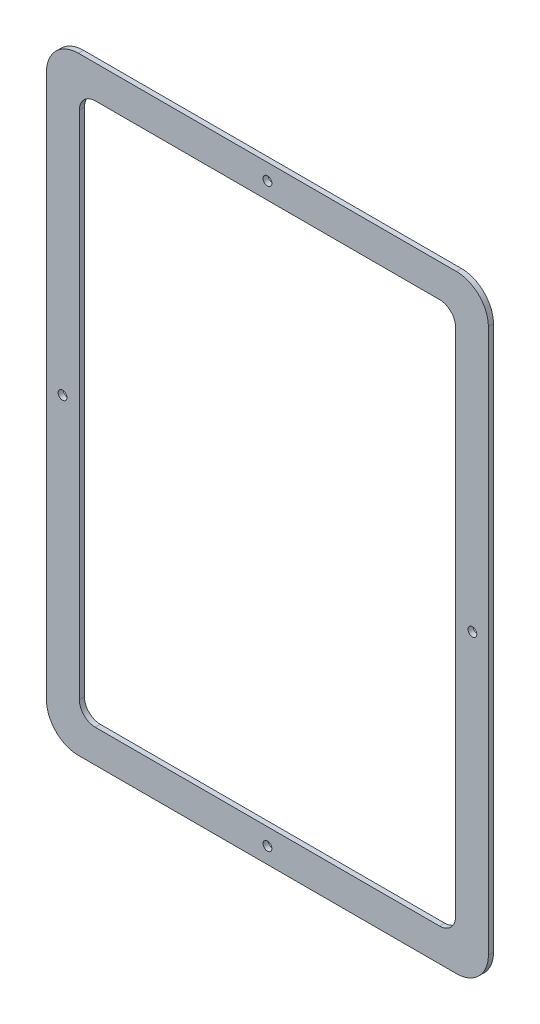
ISO-10303-21;
HEADER;
FILE_DESCRIPTION(('STEP AP214'),'2;1');
FILE_NAME('part.step','',(''),(''),'','','');
FILE_SCHEMA(('AUTOMOTIVE_DESIGN { 1 0 10303 214 1 1 1 1 }'));
ENDSEC;
DATA;
#1=APPLICATION_CONTEXT('core data for automotive mechanical design processes');
#2=APPLICATION_PROTOCOL_DEFINITION('international standard','automotive_design',2000,#1);
#3=PRODUCT_CONTEXT('',#1,'mechanical');
#4=PRODUCT('Part','Part','',(#3));
#5=PRODUCT_RELATED_PRODUCT_CATEGORY('part','',(#4));
#6=PRODUCT_DEFINITION_FORMATION('','',#4);
#7=PRODUCT_DEFINITION_CONTEXT('part definition',#1,'design');
#8=PRODUCT_DEFINITION('design','',#6,#7);
#9=PRODUCT_DEFINITION_SHAPE('','',#8);
#10=(LENGTH_UNIT() NAMED_UNIT(*) SI_UNIT(.MILLI.,.METRE.));
#11=(NAMED_UNIT(*) PLANE_ANGLE_UNIT() SI_UNIT($,.RADIAN.));
#12=(NAMED_UNIT(*) SI_UNIT($,.STERADIAN.) SOLID_ANGLE_UNIT());
#13=UNCERTAINTY_MEASURE_WITH_UNIT(LENGTH_MEASURE(1.E-05),#10,'distance_accuracy_value','');
#14=(GEOMETRIC_REPRESENTATION_CONTEXT(3) GLOBAL_UNCERTAINTY_ASSIGNED_CONTEXT((#13)) GLOBAL_UNIT_ASSIGNED_CONTEXT((#10,
#11,#12)) REPRESENTATION_CONTEXT('',''));
#15=CARTESIAN_POINT('',(0.,0.,0.));
#16=DIRECTION('',(0.,0.,1.));
#17=DIRECTION('',(1.,0.,0.));
#18=AXIS2_PLACEMENT_3D('',#15,#16,#17);
#19=CARTESIAN_POINT('',(-544.089347611488,-12.4195033639551,-257.580431195113));
#20=DIRECTION('',(0.,0.,1.));
#21=DIRECTION('',(1.,0.,0.));
#22=AXIS2_PLACEMENT_3D('',#19,#20,#21);
#23=PLANE('',#22);
#24=DIRECTION('',(0.,1.,0.));
#25=VECTOR('',#24,1.);
#26=CARTESIAN_POINT('',(-490.489347611488,-587.399903363955,-257.580431195113));
#27=LINE('',#26,#25);
#28=CARTESIAN_POINT('',(-490.489347611488,-567.399903363955,-257.580431195113));
#29=VERTEX_POINT('',#28);
#30=CARTESIAN_POINT('',(-490.489347611488,-227.543903363955,-257.580431195113));
#31=VERTEX_POINT('',#30);
#32=EDGE_CURVE('E246',#29,#31,#27,.T.);
#33=ORIENTED_EDGE('',*,*,#32,.F.);
#34=CARTESIAN_POINT('',(-470.489347611488,-567.399903363955,-257.580431195113));
#35=DIRECTION('',(0.,0.,-1.));
#36=DIRECTION('',(-1.,0.,0.));
#37=AXIS2_PLACEMENT_3D('',#34,#35,#36);
#38=CIRCLE('',#37,20.);
#39=CARTESIAN_POINT('',(-470.489347611488,-587.399903363955,-257.580431195113));
#40=VERTEX_POINT('',#39);
#41=EDGE_CURVE('E224',#40,#29,#38,.T.);
#42=ORIENTED_EDGE('',*,*,#41,.F.);
#43=DIRECTION('',(1.,0.,0.));
#44=VECTOR('',#43,1.);
#45=CARTESIAN_POINT('',(-214.489347611488,-587.399903363955,-257.580431195113));
#46=LINE('',#45,#44);
#47=CARTESIAN_POINT('',(-234.489347611488,-587.399903363955,-257.580431195113));
#48=VERTEX_POINT('',#47);
#49=EDGE_CURVE('E154',#48,#40,#46,.F.);
#50=ORIENTED_EDGE('',*,*,#49,.F.);
#51=CARTESIAN_POINT('',(-234.489347611488,-567.399903363955,-257.580431195113));
#52=DIRECTION('',(0.,0.,1.));
#53=DIRECTION('',(1.,0.,0.));
#54=AXIS2_PLACEMENT_3D('',#51,#52,#53);
#55=CIRCLE('',#54,20.);
#56=CARTESIAN_POINT('',(-214.489347611488,-567.399903363955,-257.580431195113));
#57=VERTEX_POINT('',#56);
#58=EDGE_CURVE('E219',#57,#48,#55,.F.);
#59=ORIENTED_EDGE('',*,*,#58,.F.);
#60=DIRECTION('',(0.,1.,0.));
#61=VECTOR('',#60,1.);
#62=CARTESIAN_POINT('',(-214.489347611488,-207.543903363955,-257.580431195113));
#63=LINE('',#62,#61);
#64=CARTESIAN_POINT('',(-214.489347611488,-227.543903363955,-257.580431195113));
#65=VERTEX_POINT('',#64);
#66=EDGE_CURVE('E222',#65,#57,#63,.F.);
#67=ORIENTED_EDGE('',*,*,#66,.F.);
#68=CARTESIAN_POINT('',(-234.489347611488,-227.543903363955,-257.580431195113));
#69=DIRECTION('',(0.,0.,1.));
#70=DIRECTION('',(1.,0.,0.));
#71=AXIS2_PLACEMENT_3D('',#68,#69,#70);
#72=CIRCLE('',#71,20.);
#73=CARTESIAN_POINT('',(-234.489347611488,-207.543903363955,-257.580431195113));
#74=VERTEX_POINT('',#73);
#75=EDGE_CURVE('E214',#74,#65,#72,.F.);
#76=ORIENTED_EDGE('',*,*,#75,.F.);
#77=DIRECTION('',(1.,0.,0.));
#78=VECTOR('',#77,1.);
#79=CARTESIAN_POINT('',(-490.489347611488,-207.543903363955,-257.580431195113));
#80=LINE('',#79,#78);
#81=CARTESIAN_POINT('',(-470.489347611488,-207.543903363955,-257.580431195113));
#82=VERTEX_POINT('',#81);
#83=EDGE_CURVE('E217',#82,#74,#80,.T.);
#84=ORIENTED_EDGE('',*,*,#83,.F.);
#85=CARTESIAN_POINT('',(-470.489347611488,-227.543903363955,-257.580431195113));
#86=DIRECTION('',(0.,0.,1.));
#87=DIRECTION('',(1.,0.,0.));
#88=AXIS2_PLACEMENT_3D('',#85,#86,#87);
#89=CIRCLE('',#88,20.);
#90=EDGE_CURVE('E209',#31,#82,#89,.F.);
#91=ORIENTED_EDGE('',*,*,#90,.F.);
#92=EDGE_LOOP('',(#33,#42,#50,#59,#67,#76,#84,#91));
#93=FACE_BOUND('',#92,.T.);
#94=CARTESIAN_POINT('',(-480.489347611488,-397.471903363955,-257.580431195113));
#95=DIRECTION('',(0.,0.,1.));
#96=DIRECTION('',(1.,0.,0.));
#97=AXIS2_PLACEMENT_3D('',#94,#95,#96);
#98=CIRCLE('',#97,2.75);
#99=CARTESIAN_POINT('',(-477.739347611488,-397.471903363955,-257.580431195113));
#100=VERTEX_POINT('',#99);
#101=EDGE_CURVE('E229',#100,#100,#98,.F.);
#102=ORIENTED_EDGE('',*,*,#101,.T.);
#103=EDGE_LOOP('',(#102));
#104=FACE_BOUND('',#103,.T.);
#105=CARTESIAN_POINT('',(-352.489347611488,-217.543903363955,-257.580431195113));
#106=DIRECTION('',(0.,0.,1.));
#107=DIRECTION('',(1.,0.,0.));
#108=AXIS2_PLACEMENT_3D('',#105,#106,#107);
#109=CIRCLE('',#108,2.75);
#110=CARTESIAN_POINT('',(-349.739347611488,-217.543903363955,-257.580431195113));
#111=VERTEX_POINT('',#110);
#112=EDGE_CURVE('E147',#111,#111,#109,.F.);
#113=ORIENTED_EDGE('',*,*,#112,.T.);
#114=EDGE_LOOP('',(#113));
#115=FACE_BOUND('',#114,.T.);
#116=CARTESIAN_POINT('',(-352.489347611488,-577.399903363955,-257.580431195113));
#117=DIRECTION('',(0.,0.,1.));
#118=DIRECTION('',(1.,0.,0.));
#119=AXIS2_PLACEMENT_3D('',#116,#117,#118);
#120=CIRCLE('',#119,2.75);
#121=CARTESIAN_POINT('',(-349.739347611488,-577.399903363955,-257.580431195113));
#122=VERTEX_POINT('',#121);
#123=EDGE_CURVE('E150',#122,#122,#120,.F.);
#124=ORIENTED_EDGE('',*,*,#123,.T.);
#125=EDGE_LOOP('',(#124));
#126=FACE_BOUND('',#125,.T.);
#127=CARTESIAN_POINT('',(-224.489347611488,-397.471903363955,-257.580431195113));
#128=DIRECTION('',(0.,0.,1.));
#129=DIRECTION('',(1.,0.,0.));
#130=AXIS2_PLACEMENT_3D('',#127,#128,#129);
#131=CIRCLE('',#130,2.75);
#132=CARTESIAN_POINT('',(-221.739347611488,-397.471903363955,-257.580431195113));
#133=VERTEX_POINT('',#132);
#134=EDGE_CURVE('E226',#133,#133,#131,.F.);
#135=ORIENTED_EDGE('',*,*,#134,.T.);
#136=EDGE_LOOP('',(#135));
#137=FACE_BOUND('',#136,.T.);
#138=DIRECTION('',(0.,1.,0.));
#139=VECTOR('',#138,1.);
#140=CARTESIAN_POINT('',(-234.989347611488,-547.399903363955,-257.580431195113));
#141=LINE('',#140,#139);
#142=CARTESIAN_POINT('',(-234.989347611488,-556.899903363955,-257.580431195113));
#143=VERTEX_POINT('',#142);
#144=CARTESIAN_POINT('',(-234.989347611488,-238.043903363955,-257.580431195113));
#145=VERTEX_POINT('',#144);
#146=EDGE_CURVE('E156',#143,#145,#141,.T.);
#147=ORIENTED_EDGE('',*,*,#146,.F.);
#148=CARTESIAN_POINT('',(-244.989347611488,-556.899903363955,-257.580431195113));
#149=DIRECTION('',(0.,0.,1.));
#150=DIRECTION('',(1.,0.,0.));
#151=AXIS2_PLACEMENT_3D('',#148,#149,#150);
#152=CIRCLE('',#151,10.);
#153=CARTESIAN_POINT('',(-244.989347611488,-566.899903363955,-257.580431195113));
#154=VERTEX_POINT('',#153);
#155=EDGE_CURVE('E146',#143,#154,#152,.F.);
#156=ORIENTED_EDGE('',*,*,#155,.T.);
#157=DIRECTION('',(1.,0.,0.));
#158=VECTOR('',#157,1.);
#159=CARTESIAN_POINT('',(-450.489347611488,-566.899903363955,-257.580431195113));
#160=LINE('',#159,#158);
#161=CARTESIAN_POINT('',(-459.989347611488,-566.899903363955,-257.580431195113));
#162=VERTEX_POINT('',#161);
#163=EDGE_CURVE('E139',#162,#154,#160,.T.);
#164=ORIENTED_EDGE('',*,*,#163,.F.);
#165=CARTESIAN_POINT('',(-459.989347611488,-556.899903363955,-257.580431195113));
#166=DIRECTION('',(0.,0.,1.));
#167=DIRECTION('',(1.,0.,0.));
#168=AXIS2_PLACEMENT_3D('',#165,#166,#167);
#169=CIRCLE('',#168,10.);
#170=CARTESIAN_POINT('',(-469.989347611488,-556.899903363955,-257.580431195113));
#171=VERTEX_POINT('',#170);
#172=EDGE_CURVE('E20',#162,#171,#169,.F.);
#173=ORIENTED_EDGE('',*,*,#172,.T.);
#174=DIRECTION('',(0.,1.,0.));
#175=VECTOR('',#174,1.);
#176=CARTESIAN_POINT('',(-469.989347611488,-247.543903363955,-257.580431195113));
#177=LINE('',#176,#175);
#178=CARTESIAN_POINT('',(-469.989347611488,-238.043903363955,-257.580431195113));
#179=VERTEX_POINT('',#178);
#180=EDGE_CURVE('E166',#179,#171,#177,.F.);
#181=ORIENTED_EDGE('',*,*,#180,.F.);
#182=CARTESIAN_POINT('',(-459.989347611488,-238.043903363955,-257.580431195113));
#183=DIRECTION('',(0.,0.,1.));
#184=DIRECTION('',(1.,0.,0.));
#185=AXIS2_PLACEMENT_3D('',#182,#183,#184);
#186=CIRCLE('',#185,10.);
#187=CARTESIAN_POINT('',(-459.989347611488,-228.043903363955,-257.580431195113));
#188=VERTEX_POINT('',#187);
#189=EDGE_CURVE('E236',#179,#188,#186,.F.);
#190=ORIENTED_EDGE('',*,*,#189,.T.);
#191=DIRECTION('',(1.,0.,0.));
#192=VECTOR('',#191,1.);
#193=CARTESIAN_POINT('',(-254.489347611488,-228.043903363955,-257.580431195113));
#194=LINE('',#193,#192);
#195=CARTESIAN_POINT('',(-244.989347611488,-228.043903363955,-257.580431195113));
#196=VERTEX_POINT('',#195);
#197=EDGE_CURVE('E161',#196,#188,#194,.F.);
#198=ORIENTED_EDGE('',*,*,#197,.F.);
#199=CARTESIAN_POINT('',(-244.989347611488,-238.043903363955,-257.580431195113));
#200=DIRECTION('',(0.,0.,1.));
#201=DIRECTION('',(1.,0.,0.));
#202=AXIS2_PLACEMENT_3D('',#199,#200,#201);
#203=CIRCLE('',#202,10.);
#204=EDGE_CURVE('E235',#196,#145,#203,.F.);
#205=ORIENTED_EDGE('',*,*,#204,.T.);
#206=EDGE_LOOP('',(#147,#156,#164,#173,#181,#190,#198,#205));
#207=FACE_BOUND('',#206,.T.);
#208=ADVANCED_FACE('F17',(#93,#104,#115,#126,#137,#207),#23,.T.);
#209=CARTESIAN_POINT('',(-459.989347611488,-556.899903363955,-260.755431195113));
#210=DIRECTION('',(0.,0.,1.));
#211=DIRECTION('',(1.,0.,0.));
#212=AXIS2_PLACEMENT_3D('',#209,#210,#211);
#213=CYLINDRICAL_SURFACE('',#212,10.);
#214=ORIENTED_EDGE('',*,*,#172,.F.);
#215=DIRECTION('',(0.,0.,1.));
#216=VECTOR('',#215,1.);
#217=CARTESIAN_POINT('',(-459.989347611488,-566.899903363955,-260.755431195113));
#218=LINE('',#217,#216);
#219=CARTESIAN_POINT('',(-459.989347611488,-566.899903363955,-260.755431195113));
#220=VERTEX_POINT('',#219);
#221=EDGE_CURVE('E130',#220,#162,#218,.T.);
#222=ORIENTED_EDGE('',*,*,#221,.F.);
#223=CARTESIAN_POINT('',(-459.989347611488,-556.899903363955,-260.755431195113));
#224=DIRECTION('',(0.,0.,1.));
#225=DIRECTION('',(1.,0.,0.));
#226=AXIS2_PLACEMENT_3D('',#223,#224,#225);
#227=CIRCLE('',#226,10.);
#228=CARTESIAN_POINT('',(-469.989347611488,-556.899903363955,-260.755431195113));
#229=VERTEX_POINT('',#228);
#230=EDGE_CURVE('E207',#220,#229,#227,.F.);
#231=ORIENTED_EDGE('',*,*,#230,.T.);
#232=DIRECTION('',(0.,0.,-1.));
#233=VECTOR('',#232,1.);
#234=CARTESIAN_POINT('',(-469.989347611488,-556.899903363955,-260.755431195113));
#235=LINE('',#234,#233);
#236=EDGE_CURVE('E132',#171,#229,#235,.T.);
#237=ORIENTED_EDGE('',*,*,#236,.F.);
#238=EDGE_LOOP('',(#214,#222,#231,#237));
#239=FACE_BOUND('',#238,.T.);
#240=ADVANCED_FACE('F128',(#239),#213,.F.);
#241=CARTESIAN_POINT('',(-469.989347611488,-247.543903363955,-260.755431195113));
#242=DIRECTION('',(1.,0.,0.));
#243=DIRECTION('',(0.,0.,-1.));
#244=AXIS2_PLACEMENT_3D('',#241,#242,#243);
#245=PLANE('',#244);
#246=DIRECTION('',(0.,0.,1.));
#247=VECTOR('',#246,1.);
#248=CARTESIAN_POINT('',(-469.989347611488,-238.043903363955,-260.755431195113));
#249=LINE('',#248,#247);
#250=CARTESIAN_POINT('',(-469.989347611488,-238.043903363955,-260.755431195113));
#251=VERTEX_POINT('',#250);
#252=EDGE_CURVE('E168',#251,#179,#249,.T.);
#253=ORIENTED_EDGE('',*,*,#252,.T.);
#254=ORIENTED_EDGE('',*,*,#180,.T.);
#255=ORIENTED_EDGE('',*,*,#236,.T.);
#256=DIRECTION('',(0.,1.,0.));
#257=VECTOR('',#256,1.);
#258=CARTESIAN_POINT('',(-469.989347611488,-12.4195033639551,-260.755431195113));
#259=LINE('',#258,#257);
#260=EDGE_CURVE('E206',#229,#251,#259,.T.);
#261=ORIENTED_EDGE('',*,*,#260,.T.);
#262=EDGE_LOOP('',(#253,#254,#255,#261));
#263=FACE_BOUND('',#262,.T.);
#264=ADVANCED_FACE('F488',(#263),#245,.T.);
#265=CARTESIAN_POINT('',(-459.989347611488,-238.043903363955,-260.755431195113));
#266=DIRECTION('',(0.,0.,1.));
#267=DIRECTION('',(1.,0.,0.));
#268=AXIS2_PLACEMENT_3D('',#265,#266,#267);
#269=CYLINDRICAL_SURFACE('',#268,10.);
#270=ORIENTED_EDGE('',*,*,#189,.F.);
#271=ORIENTED_EDGE('',*,*,#252,.F.);
#272=CARTESIAN_POINT('',(-459.989347611488,-238.043903363955,-260.755431195113));
#273=DIRECTION('',(0.,0.,1.));
#274=DIRECTION('',(1.,0.,0.));
#275=AXIS2_PLACEMENT_3D('',#272,#273,#274);
#276=CIRCLE('',#275,10.);
#277=CARTESIAN_POINT('',(-459.989347611488,-228.043903363955,-260.755431195113));
#278=VERTEX_POINT('',#277);
#279=EDGE_CURVE('E203',#251,#278,#276,.F.);
#280=ORIENTED_EDGE('',*,*,#279,.T.);
#281=DIRECTION('',(0.,0.,-1.));
#282=VECTOR('',#281,1.);
#283=CARTESIAN_POINT('',(-459.989347611488,-228.043903363955,-260.755431195113));
#284=LINE('',#283,#282);
#285=EDGE_CURVE('E165',#188,#278,#284,.T.);
#286=ORIENTED_EDGE('',*,*,#285,.F.);
#287=EDGE_LOOP('',(#270,#271,#280,#286));
#288=FACE_BOUND('',#287,.T.);
#289=ADVANCED_FACE('F480',(#288),#269,.F.);
#290=CARTESIAN_POINT('',(-254.489347611488,-228.043903363955,-260.755431195113));
#291=DIRECTION('',(0.,-1.,0.));
#292=DIRECTION('',(0.,0.,-1.));
#293=AXIS2_PLACEMENT_3D('',#290,#291,#292);
#294=PLANE('',#293);
#295=DIRECTION('',(0.,0.,1.));
#296=VECTOR('',#295,1.);
#297=CARTESIAN_POINT('',(-244.989347611488,-228.043903363955,-260.755431195113));
#298=LINE('',#297,#296);
#299=CARTESIAN_POINT('',(-244.989347611488,-228.043903363955,-260.755431195113));
#300=VERTEX_POINT('',#299);
#301=EDGE_CURVE('E164',#300,#196,#298,.T.);
#302=ORIENTED_EDGE('',*,*,#301,.T.);
#303=ORIENTED_EDGE('',*,*,#197,.T.);
#304=ORIENTED_EDGE('',*,*,#285,.T.);
#305=DIRECTION('',(1.,0.,0.));
#306=VECTOR('',#305,1.);
#307=CARTESIAN_POINT('',(-544.089347611488,-228.043903363955,-260.755431195113));
#308=LINE('',#307,#306);
#309=EDGE_CURVE('E202',#278,#300,#308,.T.);
#310=ORIENTED_EDGE('',*,*,#309,.T.);
#311=EDGE_LOOP('',(#302,#303,#304,#310));
#312=FACE_BOUND('',#311,.T.);
#313=ADVANCED_FACE('F269',(#312),#294,.T.);
#314=CARTESIAN_POINT('',(-244.989347611488,-238.043903363955,-260.755431195113));
#315=DIRECTION('',(0.,0.,1.));
#316=DIRECTION('',(1.,0.,0.));
#317=AXIS2_PLACEMENT_3D('',#314,#315,#316);
#318=CYLINDRICAL_SURFACE('',#317,10.);
#319=ORIENTED_EDGE('',*,*,#204,.F.);
#320=ORIENTED_EDGE('',*,*,#301,.F.);
#321=CARTESIAN_POINT('',(-244.989347611488,-238.043903363955,-260.755431195113));
#322=DIRECTION('',(0.,0.,1.));
#323=DIRECTION('',(1.,0.,0.));
#324=AXIS2_PLACEMENT_3D('',#321,#322,#323);
#325=CIRCLE('',#324,10.);
#326=CARTESIAN_POINT('',(-234.989347611488,-238.043903363955,-260.755431195113));
#327=VERTEX_POINT('',#326);
#328=EDGE_CURVE('E199',#300,#327,#325,.F.);
#329=ORIENTED_EDGE('',*,*,#328,.T.);
#330=DIRECTION('',(0.,0.,1.));
#331=VECTOR('',#330,1.);
#332=CARTESIAN_POINT('',(-234.989347611488,-238.043903363955,-260.755431195113));
#333=LINE('',#332,#331);
#334=EDGE_CURVE('E160',#145,#327,#333,.F.);
#335=ORIENTED_EDGE('',*,*,#334,.F.);
#336=EDGE_LOOP('',(#319,#320,#329,#335));
#337=FACE_BOUND('',#336,.T.);
#338=ADVANCED_FACE('F275',(#337),#318,.F.);
#339=CARTESIAN_POINT('',(-234.989347611488,-547.399903363955,-260.755431195113));
#340=DIRECTION('',(-1.,0.,0.));
#341=DIRECTION('',(0.,0.,1.));
#342=AXIS2_PLACEMENT_3D('',#339,#340,#341);
#343=PLANE('',#342);
#344=DIRECTION('',(0.,0.,1.));
#345=VECTOR('',#344,1.);
#346=CARTESIAN_POINT('',(-234.989347611488,-556.899903363955,-260.755431195113));
#347=LINE('',#346,#345);
#348=CARTESIAN_POINT('',(-234.989347611488,-556.899903363955,-260.755431195113));
#349=VERTEX_POINT('',#348);
#350=EDGE_CURVE('E159',#349,#143,#347,.T.);
#351=ORIENTED_EDGE('',*,*,#350,.T.);
#352=ORIENTED_EDGE('',*,*,#146,.T.);
#353=ORIENTED_EDGE('',*,*,#334,.T.);
#354=DIRECTION('',(0.,1.,0.));
#355=VECTOR('',#354,1.);
#356=CARTESIAN_POINT('',(-234.989347611488,-12.4195033639551,-260.755431195113));
#357=LINE('',#356,#355);
#358=EDGE_CURVE('E198',#327,#349,#357,.F.);
#359=ORIENTED_EDGE('',*,*,#358,.T.);
#360=EDGE_LOOP('',(#351,#352,#353,#359));
#361=FACE_BOUND('',#360,.T.);
#362=ADVANCED_FACE('F457',(#361),#343,.T.);
#363=CARTESIAN_POINT('',(-244.989347611488,-556.899903363955,-260.755431195113));
#364=DIRECTION('',(0.,0.,1.));
#365=DIRECTION('',(1.,0.,0.));
#366=AXIS2_PLACEMENT_3D('',#363,#364,#365);
#367=CYLINDRICAL_SURFACE('',#366,10.);
#368=ORIENTED_EDGE('',*,*,#155,.F.);
#369=ORIENTED_EDGE('',*,*,#350,.F.);
#370=CARTESIAN_POINT('',(-244.989347611488,-556.899903363955,-260.755431195113));
#371=DIRECTION('',(0.,0.,1.));
#372=DIRECTION('',(1.,0.,0.));
#373=AXIS2_PLACEMENT_3D('',#370,#371,#372);
#374=CIRCLE('',#373,10.);
#375=CARTESIAN_POINT('',(-244.989347611488,-566.899903363955,-260.755431195113));
#376=VERTEX_POINT('',#375);
#377=EDGE_CURVE('E195',#349,#376,#374,.F.);
#378=ORIENTED_EDGE('',*,*,#377,.T.);
#379=DIRECTION('',(0.,0.,1.));
#380=VECTOR('',#379,1.);
#381=CARTESIAN_POINT('',(-244.989347611488,-566.899903363955,-260.755431195113));
#382=LINE('',#381,#380);
#383=EDGE_CURVE('E143',#154,#376,#382,.F.);
#384=ORIENTED_EDGE('',*,*,#383,.F.);
#385=EDGE_LOOP('',(#368,#369,#378,#384));
#386=FACE_BOUND('',#385,.T.);
#387=ADVANCED_FACE('F449',(#386),#367,.F.);
#388=CARTESIAN_POINT('',(-450.489347611488,-566.899903363955,-260.755431195113));
#389=DIRECTION('',(0.,1.,0.));
#390=DIRECTION('',(0.,0.,1.));
#391=AXIS2_PLACEMENT_3D('',#388,#389,#390);
#392=PLANE('',#391);
#393=ORIENTED_EDGE('',*,*,#221,.T.);
#394=ORIENTED_EDGE('',*,*,#163,.T.);
#395=ORIENTED_EDGE('',*,*,#383,.T.);
#396=DIRECTION('',(1.,0.,0.));
#397=VECTOR('',#396,1.);
#398=CARTESIAN_POINT('',(-544.089347611488,-566.899903363955,-260.755431195113));
#399=LINE('',#398,#397);
#400=EDGE_CURVE('E142',#376,#220,#399,.F.);
#401=ORIENTED_EDGE('',*,*,#400,.T.);
#402=EDGE_LOOP('',(#393,#394,#395,#401));
#403=FACE_BOUND('',#402,.T.);
#404=ADVANCED_FACE('F138',(#403),#392,.T.);
#405=CARTESIAN_POINT('',(-352.489347611488,-217.543903363955,-261.072933595113));
#406=DIRECTION('',(0.,0.,1.));
#407=DIRECTION('',(1.,0.,0.));
#408=AXIS2_PLACEMENT_3D('',#405,#406,#407);
#409=CYLINDRICAL_SURFACE('',#408,2.75);
#410=ORIENTED_EDGE('',*,*,#112,.F.);
#411=EDGE_LOOP('',(#410));
#412=FACE_BOUND('',#411,.T.);
#413=CARTESIAN_POINT('',(-352.489347611488,-217.543903363955,-260.755431195113));
#414=DIRECTION('',(0.,0.,1.));
#415=DIRECTION('',(1.,0.,0.));
#416=AXIS2_PLACEMENT_3D('',#413,#414,#415);
#417=CIRCLE('',#416,2.75);
#418=CARTESIAN_POINT('',(-349.739347611488,-217.543903363955,-260.755431195113));
#419=VERTEX_POINT('',#418);
#420=EDGE_CURVE('E192',#419,#419,#417,.F.);
#421=ORIENTED_EDGE('',*,*,#420,.T.);
#422=EDGE_LOOP('',(#421));
#423=FACE_BOUND('',#422,.T.);
#424=ADVANCED_FACE('F432',(#412,#423),#409,.F.);
#425=CARTESIAN_POINT('',(-352.489347611488,-577.399903363955,-261.072933595113));
#426=DIRECTION('',(0.,0.,1.));
#427=DIRECTION('',(1.,0.,0.));
#428=AXIS2_PLACEMENT_3D('',#425,#426,#427);
#429=CYLINDRICAL_SURFACE('',#428,2.75);
#430=ORIENTED_EDGE('',*,*,#123,.F.);
#431=EDGE_LOOP('',(#430));
#432=FACE_BOUND('',#431,.T.);
#433=CARTESIAN_POINT('',(-352.489347611488,-577.399903363955,-260.755431195113));
#434=DIRECTION('',(0.,0.,1.));
#435=DIRECTION('',(1.,0.,0.));
#436=AXIS2_PLACEMENT_3D('',#433,#434,#435);
#437=CIRCLE('',#436,2.75);
#438=CARTESIAN_POINT('',(-349.739347611488,-577.399903363955,-260.755431195113));
#439=VERTEX_POINT('',#438);
#440=EDGE_CURVE('E189',#439,#439,#437,.F.);
#441=ORIENTED_EDGE('',*,*,#440,.T.);
#442=EDGE_LOOP('',(#441));
#443=FACE_BOUND('',#442,.T.);
#444=ADVANCED_FACE('F423',(#432,#443),#429,.F.);
#445=CARTESIAN_POINT('',(-480.489347611488,-397.471903363955,-261.072933595113));
#446=DIRECTION('',(0.,0.,1.));
#447=DIRECTION('',(1.,0.,0.));
#448=AXIS2_PLACEMENT_3D('',#445,#446,#447);
#449=CYLINDRICAL_SURFACE('',#448,2.75);
#450=ORIENTED_EDGE('',*,*,#101,.F.);
#451=EDGE_LOOP('',(#450));
#452=FACE_BOUND('',#451,.T.);
#453=CARTESIAN_POINT('',(-480.489347611488,-397.471903363955,-260.755431195113));
#454=DIRECTION('',(0.,0.,1.));
#455=DIRECTION('',(1.,0.,0.));
#456=AXIS2_PLACEMENT_3D('',#453,#454,#455);
#457=CIRCLE('',#456,2.75);
#458=CARTESIAN_POINT('',(-477.739347611488,-397.471903363955,-260.755431195113));
#459=VERTEX_POINT('',#458);
#460=EDGE_CURVE('E186',#459,#459,#457,.F.);
#461=ORIENTED_EDGE('',*,*,#460,.T.);
#462=EDGE_LOOP('',(#461));
#463=FACE_BOUND('',#462,.T.);
#464=ADVANCED_FACE('F414',(#452,#463),#449,.F.);
#465=CARTESIAN_POINT('',(-224.489347611488,-397.471903363955,-261.072933595113));
#466=DIRECTION('',(0.,0.,1.));
#467=DIRECTION('',(1.,0.,0.));
#468=AXIS2_PLACEMENT_3D('',#465,#466,#467);
#469=CYLINDRICAL_SURFACE('',#468,2.75);
#470=ORIENTED_EDGE('',*,*,#134,.F.);
#471=EDGE_LOOP('',(#470));
#472=FACE_BOUND('',#471,.T.);
#473=CARTESIAN_POINT('',(-224.489347611488,-397.471903363955,-260.755431195113));
#474=DIRECTION('',(0.,0.,1.));
#475=DIRECTION('',(1.,0.,0.));
#476=AXIS2_PLACEMENT_3D('',#473,#474,#475);
#477=CIRCLE('',#476,2.75);
#478=CARTESIAN_POINT('',(-221.739347611488,-397.471903363955,-260.755431195113));
#479=VERTEX_POINT('',#478);
#480=EDGE_CURVE('E183',#479,#479,#477,.F.);
#481=ORIENTED_EDGE('',*,*,#480,.T.);
#482=EDGE_LOOP('',(#481));
#483=FACE_BOUND('',#482,.T.);
#484=ADVANCED_FACE('F406',(#472,#483),#469,.F.);
#485=CARTESIAN_POINT('',(-470.489347611488,-567.399903363955,-260.755431195113));
#486=DIRECTION('',(0.,0.,-1.));
#487=DIRECTION('',(-1.,0.,0.));
#488=AXIS2_PLACEMENT_3D('',#485,#486,#487);
#489=CYLINDRICAL_SURFACE('',#488,20.);
#490=DIRECTION('',(0.,0.,1.));
#491=VECTOR('',#490,1.);
#492=CARTESIAN_POINT('',(-490.489347611488,-567.399903363955,-260.755431195113));
#493=LINE('',#492,#491);
#494=CARTESIAN_POINT('',(-490.489347611488,-567.399903363955,-260.755431195113));
#495=VERTEX_POINT('',#494);
#496=EDGE_CURVE('E212',#495,#29,#493,.T.);
#497=ORIENTED_EDGE('',*,*,#496,.F.);
#498=CARTESIAN_POINT('',(-470.489347611488,-567.399903363955,-260.755431195113));
#499=DIRECTION('',(0.,0.,-1.));
#500=DIRECTION('',(-1.,0.,0.));
#501=AXIS2_PLACEMENT_3D('',#498,#499,#500);
#502=CIRCLE('',#501,20.);
#503=CARTESIAN_POINT('',(-470.489347611488,-587.399903363955,-260.755431195113));
#504=VERTEX_POINT('',#503);
#505=EDGE_CURVE('E180',#495,#504,#502,.F.);
#506=ORIENTED_EDGE('',*,*,#505,.T.);
#507=DIRECTION('',(0.,0.,-1.));
#508=VECTOR('',#507,1.);
#509=CARTESIAN_POINT('',(-470.489347611488,-587.399903363955,-260.755431195113));
#510=LINE('',#509,#508);
#511=EDGE_CURVE('E261',#40,#504,#510,.T.);
#512=ORIENTED_EDGE('',*,*,#511,.F.);
#513=ORIENTED_EDGE('',*,*,#41,.T.);
#514=EDGE_LOOP('',(#497,#506,#512,#513));
#515=FACE_BOUND('',#514,.T.);
#516=ADVANCED_FACE('F318',(#515),#489,.T.);
#517=CARTESIAN_POINT('',(-214.489347611488,-587.399903363955,-260.755431195113));
#518=DIRECTION('',(0.,-1.,0.));
#519=DIRECTION('',(0.,0.,-1.));
#520=AXIS2_PLACEMENT_3D('',#517,#518,#519);
#521=PLANE('',#520);
#522=ORIENTED_EDGE('',*,*,#511,.T.);
#523=DIRECTION('',(1.,0.,0.));
#524=VECTOR('',#523,1.);
#525=CARTESIAN_POINT('',(-544.089347611488,-587.399903363955,-260.755431195113));
#526=LINE('',#525,#524);
#527=CARTESIAN_POINT('',(-234.489347611488,-587.399903363955,-260.755431195113));
#528=VERTEX_POINT('',#527);
#529=EDGE_CURVE('E179',#504,#528,#526,.T.);
#530=ORIENTED_EDGE('',*,*,#529,.T.);
#531=DIRECTION('',(0.,0.,1.));
#532=VECTOR('',#531,1.);
#533=CARTESIAN_POINT('',(-234.489347611488,-587.399903363955,-260.755431195113));
#534=LINE('',#533,#532);
#535=EDGE_CURVE('E223',#48,#528,#534,.F.);
#536=ORIENTED_EDGE('',*,*,#535,.F.);
#537=ORIENTED_EDGE('',*,*,#49,.T.);
#538=EDGE_LOOP('',(#522,#530,#536,#537));
#539=FACE_BOUND('',#538,.T.);
#540=ADVANCED_FACE('F314',(#539),#521,.T.);
#541=CARTESIAN_POINT('',(-234.489347611488,-567.399903363955,-260.755431195113));
#542=DIRECTION('',(0.,0.,1.));
#543=DIRECTION('',(1.,0.,0.));
#544=AXIS2_PLACEMENT_3D('',#541,#542,#543);
#545=CYLINDRICAL_SURFACE('',#544,20.);
#546=DIRECTION('',(0.,0.,-1.));
#547=VECTOR('',#546,1.);
#548=CARTESIAN_POINT('',(-214.489347611488,-567.399903363955,-260.755431195113));
#549=LINE('',#548,#547);
#550=CARTESIAN_POINT('',(-214.489347611488,-567.399903363955,-260.755431195113));
#551=VERTEX_POINT('',#550);
#552=EDGE_CURVE('E249',#57,#551,#549,.T.);
#553=ORIENTED_EDGE('',*,*,#552,.F.);
#554=ORIENTED_EDGE('',*,*,#58,.T.);
#555=ORIENTED_EDGE('',*,*,#535,.T.);
#556=CARTESIAN_POINT('',(-234.489347611488,-567.399903363955,-260.755431195113));
#557=DIRECTION('',(0.,0.,1.));
#558=DIRECTION('',(1.,0.,0.));
#559=AXIS2_PLACEMENT_3D('',#556,#557,#558);
#560=CIRCLE('',#559,20.);
#561=EDGE_CURVE('E176',#528,#551,#560,.T.);
#562=ORIENTED_EDGE('',*,*,#561,.T.);
#563=EDGE_LOOP('',(#553,#554,#555,#562));
#564=FACE_BOUND('',#563,.T.);
#565=ADVANCED_FACE('F328',(#564),#545,.T.);
#566=CARTESIAN_POINT('',(-214.489347611488,-207.543903363955,-260.755431195113));
#567=DIRECTION('',(1.,0.,0.));
#568=DIRECTION('',(0.,0.,-1.));
#569=AXIS2_PLACEMENT_3D('',#566,#567,#568);
#570=PLANE('',#569);
#571=ORIENTED_EDGE('',*,*,#552,.T.);
#572=DIRECTION('',(0.,1.,0.));
#573=VECTOR('',#572,1.);
#574=CARTESIAN_POINT('',(-214.489347611488,-12.4195033639551,-260.755431195113));
#575=LINE('',#574,#573);
#576=CARTESIAN_POINT('',(-214.489347611488,-227.543903363955,-260.755431195113));
#577=VERTEX_POINT('',#576);
#578=EDGE_CURVE('E175',#551,#577,#575,.T.);
#579=ORIENTED_EDGE('',*,*,#578,.T.);
#580=DIRECTION('',(0.,0.,1.));
#581=VECTOR('',#580,1.);
#582=CARTESIAN_POINT('',(-214.489347611488,-227.543903363955,-260.755431195113));
#583=LINE('',#582,#581);
#584=EDGE_CURVE('E218',#65,#577,#583,.F.);
#585=ORIENTED_EDGE('',*,*,#584,.F.);
#586=ORIENTED_EDGE('',*,*,#66,.T.);
#587=EDGE_LOOP('',(#571,#579,#585,#586));
#588=FACE_BOUND('',#587,.T.);
#589=ADVANCED_FACE('F307',(#588),#570,.T.);
#590=CARTESIAN_POINT('',(-234.489347611488,-227.543903363955,-260.755431195113));
#591=DIRECTION('',(0.,0.,1.));
#592=DIRECTION('',(1.,0.,0.));
#593=AXIS2_PLACEMENT_3D('',#590,#591,#592);
#594=CYLINDRICAL_SURFACE('',#593,20.);
#595=DIRECTION('',(0.,0.,1.));
#596=VECTOR('',#595,1.);
#597=CARTESIAN_POINT('',(-234.489347611488,-207.543903363955,-260.755431195113));
#598=LINE('',#597,#596);
#599=CARTESIAN_POINT('',(-234.489347611488,-207.543903363955,-260.755431195113));
#600=VERTEX_POINT('',#599);
#601=EDGE_CURVE('E248',#74,#600,#598,.F.);
#602=ORIENTED_EDGE('',*,*,#601,.F.);
#603=ORIENTED_EDGE('',*,*,#75,.T.);
#604=ORIENTED_EDGE('',*,*,#584,.T.);
#605=CARTESIAN_POINT('',(-234.489347611488,-227.543903363955,-260.755431195113));
#606=DIRECTION('',(0.,0.,1.));
#607=DIRECTION('',(1.,0.,0.));
#608=AXIS2_PLACEMENT_3D('',#605,#606,#607);
#609=CIRCLE('',#608,20.);
#610=EDGE_CURVE('E172',#577,#600,#609,.T.);
#611=ORIENTED_EDGE('',*,*,#610,.T.);
#612=EDGE_LOOP('',(#602,#603,#604,#611));
#613=FACE_BOUND('',#612,.T.);
#614=ADVANCED_FACE('F306',(#613),#594,.T.);
#615=CARTESIAN_POINT('',(-490.489347611488,-207.543903363955,-260.755431195113));
#616=DIRECTION('',(0.,1.,0.));
#617=DIRECTION('',(0.,0.,1.));
#618=AXIS2_PLACEMENT_3D('',#615,#616,#617);
#619=PLANE('',#618);
#620=ORIENTED_EDGE('',*,*,#601,.T.);
#621=DIRECTION('',(1.,0.,0.));
#622=VECTOR('',#621,1.);
#623=CARTESIAN_POINT('',(-544.089347611488,-207.543903363955,-260.755431195113));
#624=LINE('',#623,#622);
#625=CARTESIAN_POINT('',(-470.489347611488,-207.543903363955,-260.755431195113));
#626=VERTEX_POINT('',#625);
#627=EDGE_CURVE('E171',#600,#626,#624,.F.);
#628=ORIENTED_EDGE('',*,*,#627,.T.);
#629=DIRECTION('',(0.,0.,1.));
#630=VECTOR('',#629,1.);
#631=CARTESIAN_POINT('',(-470.489347611488,-207.543903363955,-260.755431195113));
#632=LINE('',#631,#630);
#633=EDGE_CURVE('E213',#82,#626,#632,.F.);
#634=ORIENTED_EDGE('',*,*,#633,.F.);
#635=ORIENTED_EDGE('',*,*,#83,.T.);
#636=EDGE_LOOP('',(#620,#628,#634,#635));
#637=FACE_BOUND('',#636,.T.);
#638=ADVANCED_FACE('F297',(#637),#619,.T.);
#639=CARTESIAN_POINT('',(-470.489347611488,-227.543903363955,-260.755431195113));
#640=DIRECTION('',(0.,0.,1.));
#641=DIRECTION('',(1.,0.,0.));
#642=AXIS2_PLACEMENT_3D('',#639,#640,#641);
#643=CYLINDRICAL_SURFACE('',#642,20.);
#644=DIRECTION('',(0.,0.,1.));
#645=VECTOR('',#644,1.);
#646=CARTESIAN_POINT('',(-490.489347611488,-227.543903363955,-260.755431195113));
#647=LINE('',#646,#645);
#648=CARTESIAN_POINT('',(-490.489347611488,-227.543903363955,-260.755431195113));
#649=VERTEX_POINT('',#648);
#650=EDGE_CURVE('E34',#31,#649,#647,.F.);
#651=ORIENTED_EDGE('',*,*,#650,.F.);
#652=ORIENTED_EDGE('',*,*,#90,.T.);
#653=ORIENTED_EDGE('',*,*,#633,.T.);
#654=CARTESIAN_POINT('',(-470.489347611488,-227.543903363955,-260.755431195113));
#655=DIRECTION('',(0.,0.,1.));
#656=DIRECTION('',(1.,0.,0.));
#657=AXIS2_PLACEMENT_3D('',#654,#655,#656);
#658=CIRCLE('',#657,20.);
#659=EDGE_CURVE('E26',#626,#649,#658,.T.);
#660=ORIENTED_EDGE('',*,*,#659,.T.);
#661=EDGE_LOOP('',(#651,#652,#653,#660));
#662=FACE_BOUND('',#661,.T.);
#663=ADVANCED_FACE('F323',(#662),#643,.T.);
#664=CARTESIAN_POINT('',(-490.489347611488,-587.399903363955,-260.755431195113));
#665=DIRECTION('',(-1.,0.,0.));
#666=DIRECTION('',(0.,0.,1.));
#667=AXIS2_PLACEMENT_3D('',#664,#665,#666);
#668=PLANE('',#667);
#669=ORIENTED_EDGE('',*,*,#32,.T.);
#670=ORIENTED_EDGE('',*,*,#650,.T.);
#671=DIRECTION('',(0.,1.,0.));
#672=VECTOR('',#671,1.);
#673=CARTESIAN_POINT('',(-490.489347611488,-12.4195033639551,-260.755431195113));
#674=LINE('',#673,#672);
#675=EDGE_CURVE('E11',#649,#495,#674,.F.);
#676=ORIENTED_EDGE('',*,*,#675,.T.);
#677=ORIENTED_EDGE('',*,*,#496,.T.);
#678=EDGE_LOOP('',(#669,#670,#676,#677));
#679=FACE_BOUND('',#678,.T.);
#680=ADVANCED_FACE('F321',(#679),#668,.T.);
#681=CARTESIAN_POINT('',(-544.089347611488,-12.4195033639551,-260.755431195113));
#682=DIRECTION('',(0.,0.,1.));
#683=DIRECTION('',(1.,0.,0.));
#684=AXIS2_PLACEMENT_3D('',#681,#682,#683);
#685=PLANE('',#684);
#686=ORIENTED_EDGE('',*,*,#659,.F.);
#687=ORIENTED_EDGE('',*,*,#627,.F.);
#688=ORIENTED_EDGE('',*,*,#610,.F.);
#689=ORIENTED_EDGE('',*,*,#578,.F.);
#690=ORIENTED_EDGE('',*,*,#561,.F.);
#691=ORIENTED_EDGE('',*,*,#529,.F.);
#692=ORIENTED_EDGE('',*,*,#505,.F.);
#693=ORIENTED_EDGE('',*,*,#675,.F.);
#694=EDGE_LOOP('',(#686,#687,#688,#689,#690,#691,#692,#693));
#695=FACE_BOUND('',#694,.T.);
#696=ORIENTED_EDGE('',*,*,#480,.F.);
#697=EDGE_LOOP('',(#696));
#698=FACE_BOUND('',#697,.T.);
#699=ORIENTED_EDGE('',*,*,#460,.F.);
#700=EDGE_LOOP('',(#699));
#701=FACE_BOUND('',#700,.T.);
#702=ORIENTED_EDGE('',*,*,#440,.F.);
#703=EDGE_LOOP('',(#702));
#704=FACE_BOUND('',#703,.T.);
#705=ORIENTED_EDGE('',*,*,#420,.F.);
#706=EDGE_LOOP('',(#705));
#707=FACE_BOUND('',#706,.T.);
#708=ORIENTED_EDGE('',*,*,#377,.F.);
#709=ORIENTED_EDGE('',*,*,#358,.F.);
#710=ORIENTED_EDGE('',*,*,#328,.F.);
#711=ORIENTED_EDGE('',*,*,#309,.F.);
#712=ORIENTED_EDGE('',*,*,#279,.F.);
#713=ORIENTED_EDGE('',*,*,#260,.F.);
#714=ORIENTED_EDGE('',*,*,#230,.F.);
#715=ORIENTED_EDGE('',*,*,#400,.F.);
#716=EDGE_LOOP('',(#708,#709,#710,#711,#712,#713,#714,#715));
#717=FACE_BOUND('',#716,.T.);
#718=ADVANCED_FACE('F280',(#695,#698,#701,#704,#707,#717),#685,.F.);
#719=CLOSED_SHELL('',(#208,#240,#264,#289,#313,#338,#362,#387,#404,#424,#444,#464,#484,#516,
#540,#565,#589,#614,#638,#663,#680,#718));
#720=MANIFOLD_SOLID_BREP('B1',#719);
#721=ADVANCED_BREP_SHAPE_REPRESENTATION('',(#18,#720),#14);
#722=SHAPE_DEFINITION_REPRESENTATION(#9,#721);
ENDSEC;
END-ISO-10303-21;
